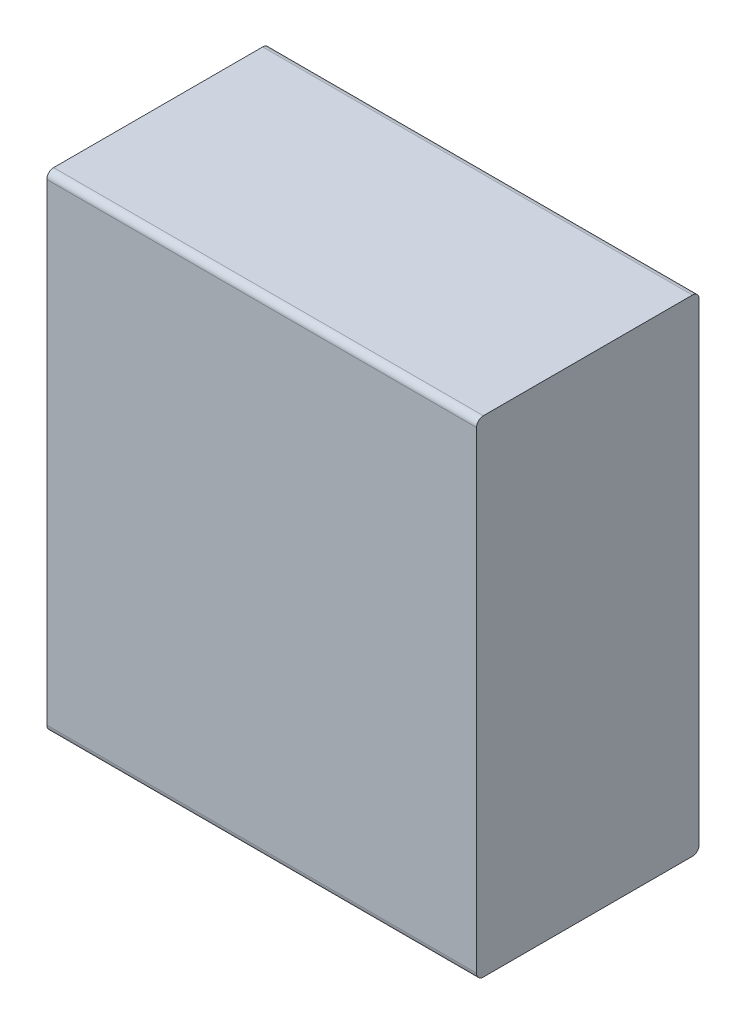
ISO-10303-21;
HEADER;
FILE_DESCRIPTION(('STEP AP214'),'2;1');
FILE_NAME('part.step','',(''),(''),'','','');
FILE_SCHEMA(('AUTOMOTIVE_DESIGN { 1 0 10303 214 1 1 1 1 }'));
ENDSEC;
DATA;
#1=APPLICATION_CONTEXT('core data for automotive mechanical design processes');
#2=APPLICATION_PROTOCOL_DEFINITION('international standard','automotive_design',2000,#1);
#3=PRODUCT_CONTEXT('',#1,'mechanical');
#4=PRODUCT('Part','Part','',(#3));
#5=PRODUCT_RELATED_PRODUCT_CATEGORY('part','',(#4));
#6=PRODUCT_DEFINITION_FORMATION('','',#4);
#7=PRODUCT_DEFINITION_CONTEXT('part definition',#1,'design');
#8=PRODUCT_DEFINITION('design','',#6,#7);
#9=PRODUCT_DEFINITION_SHAPE('','',#8);
#10=(LENGTH_UNIT() NAMED_UNIT(*) SI_UNIT(.MILLI.,.METRE.));
#11=(NAMED_UNIT(*) PLANE_ANGLE_UNIT() SI_UNIT($,.RADIAN.));
#12=(NAMED_UNIT(*) SI_UNIT($,.STERADIAN.) SOLID_ANGLE_UNIT());
#13=UNCERTAINTY_MEASURE_WITH_UNIT(LENGTH_MEASURE(1.E-05),#10,'distance_accuracy_value','');
#14=(GEOMETRIC_REPRESENTATION_CONTEXT(3) GLOBAL_UNCERTAINTY_ASSIGNED_CONTEXT((#13)) GLOBAL_UNIT_ASSIGNED_CONTEXT((#10,
#11,#12)) REPRESENTATION_CONTEXT('',''));
#15=CARTESIAN_POINT('',(0.,0.,0.));
#16=DIRECTION('',(0.,0.,1.));
#17=DIRECTION('',(1.,0.,0.));
#18=AXIS2_PLACEMENT_3D('',#15,#16,#17);
#19=CARTESIAN_POINT('',(1.425,2.43,0.07));
#20=DIRECTION('',(-1.,0.,0.));
#21=DIRECTION('',(0.,0.707106781186548,-0.707106781186547));
#22=AXIS2_PLACEMENT_3D('',#19,#20,#21);
#23=CYLINDRICAL_SURFACE('',#22,0.07);
#24=CARTESIAN_POINT('',(-2.21,2.43,0.07));
#25=DIRECTION('',(1.,0.,0.));
#26=DIRECTION('',(0.,0.707106781186548,-0.707106781186547));
#27=AXIS2_PLACEMENT_3D('',#24,#25,#26);
#28=CIRCLE('',#27,0.07);
#29=CARTESIAN_POINT('',(-2.21,2.43,0.));
#30=VERTEX_POINT('',#29);
#31=CARTESIAN_POINT('',(-2.21,2.5,0.07));
#32=VERTEX_POINT('',#31);
#33=EDGE_CURVE('E11',#30,#32,#28,.T.);
#34=ORIENTED_EDGE('',*,*,#33,.T.);
#35=DIRECTION('',(1.,0.,0.));
#36=VECTOR('',#35,1.);
#37=CARTESIAN_POINT('',(1.425,2.5,0.07));
#38=LINE('',#37,#36);
#39=CARTESIAN_POINT('',(2.21,2.5,0.07));
#40=VERTEX_POINT('',#39);
#41=EDGE_CURVE('E24',#32,#40,#38,.T.);
#42=ORIENTED_EDGE('',*,*,#41,.T.);
#43=CARTESIAN_POINT('',(2.21,2.43,0.07));
#44=DIRECTION('',(-1.,0.,0.));
#45=DIRECTION('',(0.,0.707106781186548,-0.707106781186547));
#46=AXIS2_PLACEMENT_3D('',#43,#44,#45);
#47=CIRCLE('',#46,0.07);
#48=CARTESIAN_POINT('',(2.21,2.43,0.));
#49=VERTEX_POINT('',#48);
#50=EDGE_CURVE('E99',#40,#49,#47,.T.);
#51=ORIENTED_EDGE('',*,*,#50,.T.);
#52=DIRECTION('',(-1.,0.,0.));
#53=VECTOR('',#52,1.);
#54=CARTESIAN_POINT('',(1.425,2.43,0.));
#55=LINE('',#54,#53);
#56=EDGE_CURVE('E144',#49,#30,#55,.T.);
#57=ORIENTED_EDGE('',*,*,#56,.T.);
#58=EDGE_LOOP('',(#34,#42,#51,#57));
#59=FACE_BOUND('',#58,.T.);
#60=ADVANCED_FACE('F17',(#59),#23,.T.);
#61=CARTESIAN_POINT('',(-2.21,0.,1.145));
#62=DIRECTION('',(-1.,0.,0.));
#63=DIRECTION('',(0.,0.,1.));
#64=AXIS2_PLACEMENT_3D('',#61,#62,#63);
#65=PLANE('',#64);
#66=ORIENTED_EDGE('',*,*,#33,.F.);
#67=DIRECTION('',(0.,1.,0.));
#68=VECTOR('',#67,1.);
#69=CARTESIAN_POINT('',(-2.21,0.,0.));
#70=LINE('',#69,#68);
#71=CARTESIAN_POINT('',(-2.21,-2.43,0.));
#72=VERTEX_POINT('',#71);
#73=EDGE_CURVE('E141',#72,#30,#70,.T.);
#74=ORIENTED_EDGE('',*,*,#73,.F.);
#75=CARTESIAN_POINT('',(-2.21,-2.43,0.07));
#76=DIRECTION('',(1.,0.,0.));
#77=DIRECTION('',(0.,-0.707106781186548,-0.707106781186547));
#78=AXIS2_PLACEMENT_3D('',#75,#76,#77);
#79=CIRCLE('',#78,0.07);
#80=CARTESIAN_POINT('',(-2.21,-2.5,0.07));
#81=VERTEX_POINT('',#80);
#82=EDGE_CURVE('E138',#81,#72,#79,.T.);
#83=ORIENTED_EDGE('',*,*,#82,.F.);
#84=DIRECTION('',(0.,0.,-1.));
#85=VECTOR('',#84,1.);
#86=CARTESIAN_POINT('',(-2.21,-2.5,0.5725));
#87=LINE('',#86,#85);
#88=CARTESIAN_POINT('',(-2.21,-2.5,2.22));
#89=VERTEX_POINT('',#88);
#90=EDGE_CURVE('E135',#89,#81,#87,.T.);
#91=ORIENTED_EDGE('',*,*,#90,.F.);
#92=CARTESIAN_POINT('',(-2.21,-2.43,2.22));
#93=DIRECTION('',(1.,0.,0.));
#94=DIRECTION('',(0.,-0.707106781186548,0.707106781186548));
#95=AXIS2_PLACEMENT_3D('',#92,#93,#94);
#96=CIRCLE('',#95,0.07);
#97=CARTESIAN_POINT('',(-2.21,-2.43,2.29));
#98=VERTEX_POINT('',#97);
#99=EDGE_CURVE('E132',#98,#89,#96,.T.);
#100=ORIENTED_EDGE('',*,*,#99,.F.);
#101=DIRECTION('',(0.,-1.,0.));
#102=VECTOR('',#101,1.);
#103=CARTESIAN_POINT('',(-2.21,0.,2.29));
#104=LINE('',#103,#102);
#105=CARTESIAN_POINT('',(-2.21,2.43,2.29));
#106=VERTEX_POINT('',#105);
#107=EDGE_CURVE('E129',#106,#98,#104,.T.);
#108=ORIENTED_EDGE('',*,*,#107,.F.);
#109=CARTESIAN_POINT('',(-2.21,2.43,2.22));
#110=DIRECTION('',(1.,0.,0.));
#111=DIRECTION('',(0.,0.707106781186548,0.707106781186548));
#112=AXIS2_PLACEMENT_3D('',#109,#110,#111);
#113=CIRCLE('',#112,0.07);
#114=CARTESIAN_POINT('',(-2.21,2.5,2.22));
#115=VERTEX_POINT('',#114);
#116=EDGE_CURVE('E127',#115,#106,#113,.T.);
#117=ORIENTED_EDGE('',*,*,#116,.F.);
#118=DIRECTION('',(0.,0.,1.));
#119=VECTOR('',#118,1.);
#120=CARTESIAN_POINT('',(-2.21,2.5,0.5725));
#121=LINE('',#120,#119);
#122=EDGE_CURVE('E94',#32,#115,#121,.T.);
#123=ORIENTED_EDGE('',*,*,#122,.F.);
#124=EDGE_LOOP('',(#66,#74,#83,#91,#100,#108,#117,#123));
#125=FACE_BOUND('',#124,.T.);
#126=ADVANCED_FACE('F147',(#125),#65,.T.);
#127=CARTESIAN_POINT('',(0.,0.,0.));
#128=DIRECTION('',(0.,0.,1.));
#129=DIRECTION('',(1.,0.,0.));
#130=AXIS2_PLACEMENT_3D('',#127,#128,#129);
#131=PLANE('',#130);
#132=ORIENTED_EDGE('',*,*,#56,.F.);
#133=DIRECTION('',(0.,-1.,0.));
#134=VECTOR('',#133,1.);
#135=CARTESIAN_POINT('',(2.21,0.,0.));
#136=LINE('',#135,#134);
#137=CARTESIAN_POINT('',(2.21,-2.43,0.));
#138=VERTEX_POINT('',#137);
#139=EDGE_CURVE('E124',#49,#138,#136,.T.);
#140=ORIENTED_EDGE('',*,*,#139,.T.);
#141=DIRECTION('',(1.,0.,0.));
#142=VECTOR('',#141,1.);
#143=CARTESIAN_POINT('',(-1.425,-2.43,0.));
#144=LINE('',#143,#142);
#145=EDGE_CURVE('E121',#72,#138,#144,.T.);
#146=ORIENTED_EDGE('',*,*,#145,.F.);
#147=ORIENTED_EDGE('',*,*,#73,.T.);
#148=EDGE_LOOP('',(#132,#140,#146,#147));
#149=FACE_BOUND('',#148,.T.);
#150=ADVANCED_FACE('F163',(#149),#131,.F.);
#151=CARTESIAN_POINT('',(-1.425,-2.43,0.07));
#152=DIRECTION('',(1.,0.,0.));
#153=DIRECTION('',(0.,-0.707106781186548,-0.707106781186547));
#154=AXIS2_PLACEMENT_3D('',#151,#152,#153);
#155=CYLINDRICAL_SURFACE('',#154,0.07);
#156=CARTESIAN_POINT('',(2.21,-2.43,0.07));
#157=DIRECTION('',(-1.,0.,0.));
#158=DIRECTION('',(0.,-0.707106781186548,-0.707106781186547));
#159=AXIS2_PLACEMENT_3D('',#156,#157,#158);
#160=CIRCLE('',#159,0.07);
#161=CARTESIAN_POINT('',(2.21,-2.5,0.07));
#162=VERTEX_POINT('',#161);
#163=EDGE_CURVE('E119',#138,#162,#160,.T.);
#164=ORIENTED_EDGE('',*,*,#163,.T.);
#165=DIRECTION('',(-1.,0.,0.));
#166=VECTOR('',#165,1.);
#167=CARTESIAN_POINT('',(-1.425,-2.5,0.07));
#168=LINE('',#167,#166);
#169=EDGE_CURVE('E116',#162,#81,#168,.T.);
#170=ORIENTED_EDGE('',*,*,#169,.T.);
#171=ORIENTED_EDGE('',*,*,#82,.T.);
#172=ORIENTED_EDGE('',*,*,#145,.T.);
#173=EDGE_LOOP('',(#164,#170,#171,#172));
#174=FACE_BOUND('',#173,.T.);
#175=ADVANCED_FACE('F160',(#174),#155,.T.);
#176=CARTESIAN_POINT('',(-1.425,-2.43,2.22));
#177=DIRECTION('',(1.,0.,0.));
#178=DIRECTION('',(0.,-0.707106781186548,0.707106781186548));
#179=AXIS2_PLACEMENT_3D('',#176,#177,#178);
#180=CYLINDRICAL_SURFACE('',#179,0.07);
#181=CARTESIAN_POINT('',(2.21,-2.43,2.22));
#182=DIRECTION('',(-1.,0.,0.));
#183=DIRECTION('',(0.,-0.707106781186548,0.707106781186548));
#184=AXIS2_PLACEMENT_3D('',#181,#182,#183);
#185=CIRCLE('',#184,0.07);
#186=CARTESIAN_POINT('',(2.21,-2.5,2.22));
#187=VERTEX_POINT('',#186);
#188=CARTESIAN_POINT('',(2.21,-2.43,2.29));
#189=VERTEX_POINT('',#188);
#190=EDGE_CURVE('E114',#187,#189,#185,.T.);
#191=ORIENTED_EDGE('',*,*,#190,.T.);
#192=DIRECTION('',(-1.,0.,0.));
#193=VECTOR('',#192,1.);
#194=CARTESIAN_POINT('',(-1.425,-2.43,2.29));
#195=LINE('',#194,#193);
#196=EDGE_CURVE('E111',#189,#98,#195,.T.);
#197=ORIENTED_EDGE('',*,*,#196,.T.);
#198=ORIENTED_EDGE('',*,*,#99,.T.);
#199=DIRECTION('',(1.,0.,0.));
#200=VECTOR('',#199,1.);
#201=CARTESIAN_POINT('',(-1.425,-2.5,2.22));
#202=LINE('',#201,#200);
#203=EDGE_CURVE('E108',#89,#187,#202,.T.);
#204=ORIENTED_EDGE('',*,*,#203,.T.);
#205=EDGE_LOOP('',(#191,#197,#198,#204));
#206=FACE_BOUND('',#205,.T.);
#207=ADVANCED_FACE('F155',(#206),#180,.T.);
#208=CARTESIAN_POINT('',(0.,0.,2.29));
#209=DIRECTION('',(0.,0.,1.));
#210=DIRECTION('',(1.,0.,0.));
#211=AXIS2_PLACEMENT_3D('',#208,#209,#210);
#212=PLANE('',#211);
#213=ORIENTED_EDGE('',*,*,#196,.F.);
#214=DIRECTION('',(0.,1.,0.));
#215=VECTOR('',#214,1.);
#216=CARTESIAN_POINT('',(2.21,0.,2.29));
#217=LINE('',#216,#215);
#218=CARTESIAN_POINT('',(2.21,2.43,2.29));
#219=VERTEX_POINT('',#218);
#220=EDGE_CURVE('E106',#189,#219,#217,.T.);
#221=ORIENTED_EDGE('',*,*,#220,.T.);
#222=DIRECTION('',(1.,0.,0.));
#223=VECTOR('',#222,1.);
#224=CARTESIAN_POINT('',(1.425,2.43,2.29));
#225=LINE('',#224,#223);
#226=EDGE_CURVE('E84',#106,#219,#225,.T.);
#227=ORIENTED_EDGE('',*,*,#226,.F.);
#228=ORIENTED_EDGE('',*,*,#107,.T.);
#229=EDGE_LOOP('',(#213,#221,#227,#228));
#230=FACE_BOUND('',#229,.T.);
#231=ADVANCED_FACE('F150',(#230),#212,.T.);
#232=CARTESIAN_POINT('',(1.425,2.43,2.22));
#233=DIRECTION('',(-1.,0.,0.));
#234=DIRECTION('',(0.,0.707106781186548,0.707106781186548));
#235=AXIS2_PLACEMENT_3D('',#232,#233,#234);
#236=CYLINDRICAL_SURFACE('',#235,0.07);
#237=ORIENTED_EDGE('',*,*,#116,.T.);
#238=ORIENTED_EDGE('',*,*,#226,.T.);
#239=CARTESIAN_POINT('',(2.21,2.43,2.22));
#240=DIRECTION('',(-1.,0.,0.));
#241=DIRECTION('',(0.,0.707106781186548,0.707106781186548));
#242=AXIS2_PLACEMENT_3D('',#239,#240,#241);
#243=CIRCLE('',#242,0.07);
#244=CARTESIAN_POINT('',(2.21,2.5,2.22));
#245=VERTEX_POINT('',#244);
#246=EDGE_CURVE('E78',#219,#245,#243,.T.);
#247=ORIENTED_EDGE('',*,*,#246,.T.);
#248=DIRECTION('',(-1.,0.,0.));
#249=VECTOR('',#248,1.);
#250=CARTESIAN_POINT('',(1.425,2.5,2.22));
#251=LINE('',#250,#249);
#252=EDGE_CURVE('E82',#245,#115,#251,.T.);
#253=ORIENTED_EDGE('',*,*,#252,.T.);
#254=EDGE_LOOP('',(#237,#238,#247,#253));
#255=FACE_BOUND('',#254,.T.);
#256=ADVANCED_FACE('F81',(#255),#236,.T.);
#257=CARTESIAN_POINT('',(2.85,2.5,0.));
#258=DIRECTION('',(0.,1.,0.));
#259=DIRECTION('',(-1.,0.,0.));
#260=AXIS2_PLACEMENT_3D('',#257,#258,#259);
#261=PLANE('',#260);
#262=ORIENTED_EDGE('',*,*,#41,.F.);
#263=ORIENTED_EDGE('',*,*,#122,.T.);
#264=ORIENTED_EDGE('',*,*,#252,.F.);
#265=DIRECTION('',(0.,0.,-1.));
#266=VECTOR('',#265,1.);
#267=CARTESIAN_POINT('',(2.21,2.5,0.5725));
#268=LINE('',#267,#266);
#269=EDGE_CURVE('E93',#245,#40,#268,.T.);
#270=ORIENTED_EDGE('',*,*,#269,.T.);
#271=EDGE_LOOP('',(#262,#263,#264,#270));
#272=FACE_BOUND('',#271,.T.);
#273=ADVANCED_FACE('F92',(#272),#261,.T.);
#274=CARTESIAN_POINT('',(2.21,0.,1.145));
#275=DIRECTION('',(-1.,0.,0.));
#276=DIRECTION('',(0.,0.,1.));
#277=AXIS2_PLACEMENT_3D('',#274,#275,#276);
#278=PLANE('',#277);
#279=ORIENTED_EDGE('',*,*,#50,.F.);
#280=ORIENTED_EDGE('',*,*,#269,.F.);
#281=ORIENTED_EDGE('',*,*,#246,.F.);
#282=ORIENTED_EDGE('',*,*,#220,.F.);
#283=ORIENTED_EDGE('',*,*,#190,.F.);
#284=DIRECTION('',(0.,0.,1.));
#285=VECTOR('',#284,1.);
#286=CARTESIAN_POINT('',(2.21,-2.5,0.5725));
#287=LINE('',#286,#285);
#288=EDGE_CURVE('E100',#162,#187,#287,.T.);
#289=ORIENTED_EDGE('',*,*,#288,.F.);
#290=ORIENTED_EDGE('',*,*,#163,.F.);
#291=ORIENTED_EDGE('',*,*,#139,.F.);
#292=EDGE_LOOP('',(#279,#280,#281,#282,#283,#289,#290,#291));
#293=FACE_BOUND('',#292,.T.);
#294=ADVANCED_FACE('F97',(#293),#278,.F.);
#295=CARTESIAN_POINT('',(-2.85,-2.5,0.));
#296=DIRECTION('',(0.,-1.,0.));
#297=DIRECTION('',(1.,0.,0.));
#298=AXIS2_PLACEMENT_3D('',#295,#296,#297);
#299=PLANE('',#298);
#300=ORIENTED_EDGE('',*,*,#169,.F.);
#301=ORIENTED_EDGE('',*,*,#288,.T.);
#302=ORIENTED_EDGE('',*,*,#203,.F.);
#303=ORIENTED_EDGE('',*,*,#90,.T.);
#304=EDGE_LOOP('',(#300,#301,#302,#303));
#305=FACE_BOUND('',#304,.T.);
#306=ADVANCED_FACE('F158',(#305),#299,.T.);
#307=CLOSED_SHELL('',(#60,#126,#150,#175,#207,#231,#256,#273,#294,#306));
#308=MANIFOLD_SOLID_BREP('B1',#307);
#309=ADVANCED_BREP_SHAPE_REPRESENTATION('',(#18,#308),#14);
#310=SHAPE_DEFINITION_REPRESENTATION(#9,#309);
ENDSEC;
END-ISO-10303-21;
